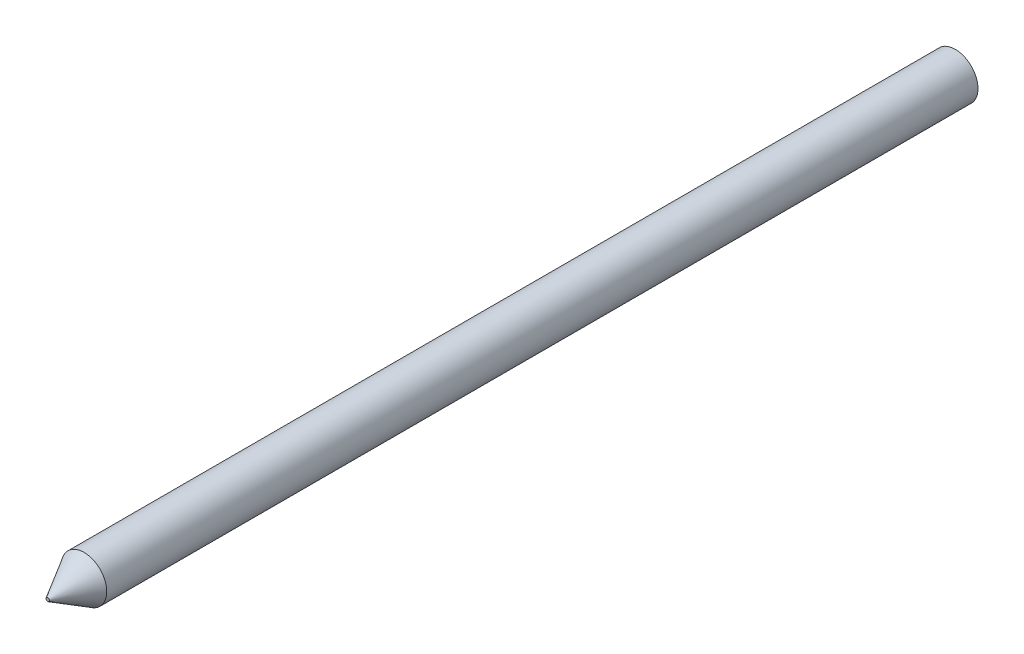
ISO-10303-21;
HEADER;
FILE_DESCRIPTION(('STEP AP214'),'2;1');
FILE_NAME('part.step','',(''),(''),'','','');
FILE_SCHEMA(('AUTOMOTIVE_DESIGN { 1 0 10303 214 1 1 1 1 }'));
ENDSEC;
DATA;
#1=APPLICATION_CONTEXT('core data for automotive mechanical design processes');
#2=APPLICATION_PROTOCOL_DEFINITION('international standard','automotive_design',2000,#1);
#3=PRODUCT_CONTEXT('',#1,'mechanical');
#4=PRODUCT('Part','Part','',(#3));
#5=PRODUCT_RELATED_PRODUCT_CATEGORY('part','',(#4));
#6=PRODUCT_DEFINITION_FORMATION('','',#4);
#7=PRODUCT_DEFINITION_CONTEXT('part definition',#1,'design');
#8=PRODUCT_DEFINITION('design','',#6,#7);
#9=PRODUCT_DEFINITION_SHAPE('','',#8);
#10=(LENGTH_UNIT() NAMED_UNIT(*) SI_UNIT(.MILLI.,.METRE.));
#11=(NAMED_UNIT(*) PLANE_ANGLE_UNIT() SI_UNIT($,.RADIAN.));
#12=(NAMED_UNIT(*) SI_UNIT($,.STERADIAN.) SOLID_ANGLE_UNIT());
#13=UNCERTAINTY_MEASURE_WITH_UNIT(LENGTH_MEASURE(1.E-05),#10,'distance_accuracy_value','');
#14=(GEOMETRIC_REPRESENTATION_CONTEXT(3) GLOBAL_UNCERTAINTY_ASSIGNED_CONTEXT((#13)) GLOBAL_UNIT_ASSIGNED_CONTEXT((#10,
#11,#12)) REPRESENTATION_CONTEXT('',''));
#15=CARTESIAN_POINT('',(0.,0.,0.));
#16=DIRECTION('',(0.,0.,1.));
#17=DIRECTION('',(1.,0.,0.));
#18=AXIS2_PLACEMENT_3D('',#15,#16,#17);
#19=CARTESIAN_POINT('',(-59.4674111811161,37.1241642055523,254.));
#20=DIRECTION('',(0.,0.,-1.));
#21=DIRECTION('',(-1.,0.,0.));
#22=AXIS2_PLACEMENT_3D('',#19,#20,#21);
#23=CYLINDRICAL_SURFACE('',#22,6.35);
#24=CARTESIAN_POINT('',(-59.4674111811161,37.1241642055523,243.84));
#25=DIRECTION('',(0.,0.,1.));
#26=DIRECTION('',(1.,0.,0.));
#27=AXIS2_PLACEMENT_3D('',#24,#25,#26);
#28=CIRCLE('',#27,6.35);
#29=CARTESIAN_POINT('',(-65.8174111811162,37.1241642055523,243.84));
#30=VERTEX_POINT('',#29);
#31=EDGE_CURVE('E10',#30,#30,#28,.F.);
#32=ORIENTED_EDGE('',*,*,#31,.T.);
#33=EDGE_LOOP('',(#32));
#34=FACE_BOUND('',#33,.T.);
#35=CARTESIAN_POINT('',(-59.4674111811161,37.1241642055523,0.));
#36=DIRECTION('',(0.,0.,1.));
#37=DIRECTION('',(1.,0.,0.));
#38=AXIS2_PLACEMENT_3D('',#35,#36,#37);
#39=CIRCLE('',#38,6.35);
#40=CARTESIAN_POINT('',(-53.1174111811161,37.1241642055523,0.));
#41=VERTEX_POINT('',#40);
#42=EDGE_CURVE('E49',#41,#41,#39,.T.);
#43=ORIENTED_EDGE('',*,*,#42,.T.);
#44=EDGE_LOOP('',(#43));
#45=FACE_BOUND('',#44,.T.);
#46=ADVANCED_FACE('F37',(#34,#45),#23,.T.);
#47=CARTESIAN_POINT('',(-59.4674111811161,37.1241642055523,254.));
#48=DIRECTION('',(0.,0.,1.));
#49=DIRECTION('',(1.,0.,0.));
#50=AXIS2_PLACEMENT_3D('',#47,#48,#49);
#51=PLANE('',#50);
#52=CARTESIAN_POINT('',(-59.4674111811161,37.1241642055523,254.));
#53=DIRECTION('',(0.,0.,1.));
#54=DIRECTION('',(1.,0.,0.));
#55=AXIS2_PLACEMENT_3D('',#52,#53,#54);
#56=CIRCLE('',#55,0.484121265033381);
#57=CARTESIAN_POINT('',(-59.9515324461495,37.1241642055523,254.));
#58=VERTEX_POINT('',#57);
#59=EDGE_CURVE('E45',#58,#58,#56,.T.);
#60=ORIENTED_EDGE('',*,*,#59,.T.);
#61=EDGE_LOOP('',(#60));
#62=FACE_BOUND('',#61,.T.);
#63=ADVANCED_FACE('F59',(#62),#51,.T.);
#64=CARTESIAN_POINT('',(-59.4674111811161,37.1241642055523,0.));
#65=DIRECTION('',(0.,0.,1.));
#66=DIRECTION('',(1.,0.,0.));
#67=AXIS2_PLACEMENT_3D('',#64,#65,#66);
#68=PLANE('',#67);
#69=ORIENTED_EDGE('',*,*,#42,.F.);
#70=EDGE_LOOP('',(#69));
#71=FACE_BOUND('',#70,.T.);
#72=ADVANCED_FACE('F57',(#71),#68,.F.);
#73=CARTESIAN_POINT('',(-59.4674111811161,37.1241642055523,254.));
#74=DIRECTION('',(0.,0.,-1.));
#75=DIRECTION('',(-1.,0.,0.));
#76=AXIS2_PLACEMENT_3D('',#73,#74,#75);
#77=CONICAL_SURFACE('',#76,0.484121265033381,0.523598775598298);
#78=CARTESIAN_POINT('',(-65.8174111811162,37.1241642055523,243.84));
#79=CARTESIAN_POINT('',(-65.7563082776269,37.1241642055523,243.945833333333));
#80=CARTESIAN_POINT('',(-65.6952053741377,37.1241642055523,244.051666666667));
#81=CARTESIAN_POINT('',(-65.5729995671592,37.1241642055523,244.263333333333));
#82=CARTESIAN_POINT('',(-65.51189666367,37.1241642055523,244.369166666667));
#83=CARTESIAN_POINT('',(-65.3896908566915,37.1241642055523,244.580833333333));
#84=CARTESIAN_POINT('',(-65.3285879532023,37.1241642055523,244.686666666667));
#85=CARTESIAN_POINT('',(-65.2063821462238,37.1241642055523,244.898333333333));
#86=CARTESIAN_POINT('',(-65.1452792427346,37.1241642055523,245.004166666667));
#87=CARTESIAN_POINT('',(-65.0230734357561,37.1241642055523,245.215833333333));
#88=CARTESIAN_POINT('',(-64.9619705322669,37.1241642055523,245.321666666667));
#89=CARTESIAN_POINT('',(-64.8397647252884,37.1241642055523,245.533333333333));
#90=CARTESIAN_POINT('',(-64.7786618217992,37.1241642055523,245.639166666667));
#91=CARTESIAN_POINT('',(-64.6564560148207,37.1241642055523,245.850833333333));
#92=CARTESIAN_POINT('',(-64.5953531113314,37.1241642055523,245.956666666667));
#93=CARTESIAN_POINT('',(-64.473147304353,37.1241642055523,246.168333333333));
#94=CARTESIAN_POINT('',(-64.4120444008637,37.1241642055523,246.274166666667));
#95=CARTESIAN_POINT('',(-64.2898385938853,37.1241642055523,246.485833333333));
#96=CARTESIAN_POINT('',(-64.228735690396,37.1241642055523,246.591666666667));
#97=CARTESIAN_POINT('',(-64.1065298834176,37.1241642055523,246.803333333333));
#98=CARTESIAN_POINT('',(-64.0454269799283,37.1241642055523,246.909166666667));
#99=CARTESIAN_POINT('',(-63.9232211729499,37.1241642055523,247.120833333333));
#100=CARTESIAN_POINT('',(-63.8621182694606,37.1241642055523,247.226666666667));
#101=CARTESIAN_POINT('',(-63.7399124624821,37.1241642055523,247.438333333333));
#102=CARTESIAN_POINT('',(-63.6788095589929,37.1241642055523,247.544166666667));
#103=CARTESIAN_POINT('',(-63.5566037520144,37.1241642055523,247.755833333333));
#104=CARTESIAN_POINT('',(-63.4955008485252,37.1241642055523,247.861666666667));
#105=CARTESIAN_POINT('',(-63.3732950415467,37.1241642055523,248.073333333333));
#106=CARTESIAN_POINT('',(-63.3121921380575,37.1241642055523,248.179166666667));
#107=CARTESIAN_POINT('',(-63.189986331079,37.1241642055523,248.390833333333));
#108=CARTESIAN_POINT('',(-63.1288834275898,37.1241642055523,248.496666666667));
#109=CARTESIAN_POINT('',(-63.0066776206113,37.1241642055523,248.708333333333));
#110=CARTESIAN_POINT('',(-62.9455747171221,37.1241642055523,248.814166666667));
#111=CARTESIAN_POINT('',(-62.8233689101436,37.1241642055523,249.025833333333));
#112=CARTESIAN_POINT('',(-62.7622660066544,37.1241642055523,249.131666666667));
#113=CARTESIAN_POINT('',(-62.6400601996759,37.1241642055523,249.343333333333));
#114=CARTESIAN_POINT('',(-62.5789572961867,37.1241642055523,249.449166666667));
#115=CARTESIAN_POINT('',(-62.4567514892082,37.1241642055523,249.660833333333));
#116=CARTESIAN_POINT('',(-62.395648585719,37.1241642055523,249.766666666667));
#117=CARTESIAN_POINT('',(-62.2734427787405,37.1241642055523,249.978333333333));
#118=CARTESIAN_POINT('',(-62.2123398752513,37.1241642055523,250.084166666667));
#119=CARTESIAN_POINT('',(-62.0901340682728,37.1241642055523,250.295833333333));
#120=CARTESIAN_POINT('',(-62.0290311647835,37.1241642055523,250.401666666667));
#121=CARTESIAN_POINT('',(-61.9068253578051,37.1241642055523,250.613333333333));
#122=CARTESIAN_POINT('',(-61.8457224543159,37.1241642055523,250.719166666667));
#123=CARTESIAN_POINT('',(-61.7235166473374,37.1241642055523,250.930833333333));
#124=CARTESIAN_POINT('',(-61.6624137438481,37.1241642055523,251.036666666667));
#125=CARTESIAN_POINT('',(-61.5402079368697,37.1241642055523,251.248333333333));
#126=CARTESIAN_POINT('',(-61.4791050333804,37.1241642055523,251.354166666667));
#127=CARTESIAN_POINT('',(-61.356899226402,37.1241642055523,251.565833333333));
#128=CARTESIAN_POINT('',(-61.2957963229127,37.1241642055523,251.671666666667));
#129=CARTESIAN_POINT('',(-61.1735905159343,37.1241642055523,251.883333333333));
#130=CARTESIAN_POINT('',(-61.112487612445,37.1241642055523,251.989166666667));
#131=CARTESIAN_POINT('',(-60.9902818054665,37.1241642055523,252.200833333333));
#132=CARTESIAN_POINT('',(-60.9291789019773,37.1241642055523,252.306666666667));
#133=CARTESIAN_POINT('',(-60.8069730949989,37.1241642055523,252.518333333333));
#134=CARTESIAN_POINT('',(-60.7458701915096,37.1241642055523,252.624166666667));
#135=CARTESIAN_POINT('',(-60.6236643845311,37.1241642055523,252.835833333333));
#136=CARTESIAN_POINT('',(-60.5625614810419,37.1241642055523,252.941666666667));
#137=CARTESIAN_POINT('',(-60.4403556740634,37.1241642055523,253.153333333333));
#138=CARTESIAN_POINT('',(-60.3792527705742,37.1241642055523,253.259166666667));
#139=CARTESIAN_POINT('',(-60.2570469635957,37.1241642055523,253.470833333333));
#140=CARTESIAN_POINT('',(-60.1959440601065,37.1241642055523,253.576666666667));
#141=CARTESIAN_POINT('',(-60.073738253128,37.1241642055523,253.788333333333));
#142=CARTESIAN_POINT('',(-60.0126353496388,37.1241642055523,253.894166666667));
#143=CARTESIAN_POINT('',(-59.9515324461495,37.1241642055523,254.));
#144=B_SPLINE_CURVE_WITH_KNOTS('',3,(#78,#79,#80,#81,#82,#83,#84,#85,#86,#87,#88,#89,#90,#91,
#92,#93,#94,#95,#96,#97,#98,#99,#100,#101,#102,#103,#104,#105,#106,#107,#108,#109,#110,#111,
#112,#113,#114,#115,#116,#117,#118,#119,#120,#121,#122,#123,#124,#125,#126,#127,#128,#129,#130,
#131,#132,#133,#134,#135,#136,#137,#138,#139,#140,#141,#142,#143),.UNSPECIFIED.,.F.,.F.,(4,2,2,
2,2,2,2,2,2,2,2,2,2,2,2,2,2,2,2,2,2,2,2,2,2,2,2,2,2,2,2,2,4),(0.,0.366617420935411,
0.733234841870821,1.09985226280623,1.46646968374164,1.83308710467705,2.19970452561246,
2.56632194654787,2.93293936748329,3.29955678841873,3.66617420935414,4.03279163028955,
4.39940905122496,4.76602647216037,5.13264389309578,5.49926131403119,5.8658787349666,
6.23249615590201,6.59911357683742,6.96573099777286,7.33234841870827,7.69896583964366,
8.06558326057909,8.43220068151448,8.79881810244991,9.16543552338535,9.53205294432074,
9.89867036525617,10.2652877861916,10.631905207127,10.9985226280624,11.3651400489978,
11.7317574699333),.UNSPECIFIED.);
#145=EDGE_CURVE('BSEAM40',#30,#58,#144,.T.);
#146=ORIENTED_EDGE('',*,*,#31,.F.);
#147=ORIENTED_EDGE('',*,*,#59,.F.);
#148=ORIENTED_EDGE('',*,*,#145,.T.);
#149=ORIENTED_EDGE('',*,*,#145,.F.);
#150=EDGE_LOOP('',(#146,#148,#147,#149));
#151=FACE_BOUND('',#150,.T.);
#152=ADVANCED_FACE('F40',(#151),#77,.T.);
#153=CLOSED_SHELL('',(#46,#63,#72,#152));
#154=MANIFOLD_SOLID_BREP('B2',#153);
#155=ADVANCED_BREP_SHAPE_REPRESENTATION('',(#18,#154),#14);
#156=SHAPE_DEFINITION_REPRESENTATION(#9,#155);
ENDSEC;
END-ISO-10303-21;
